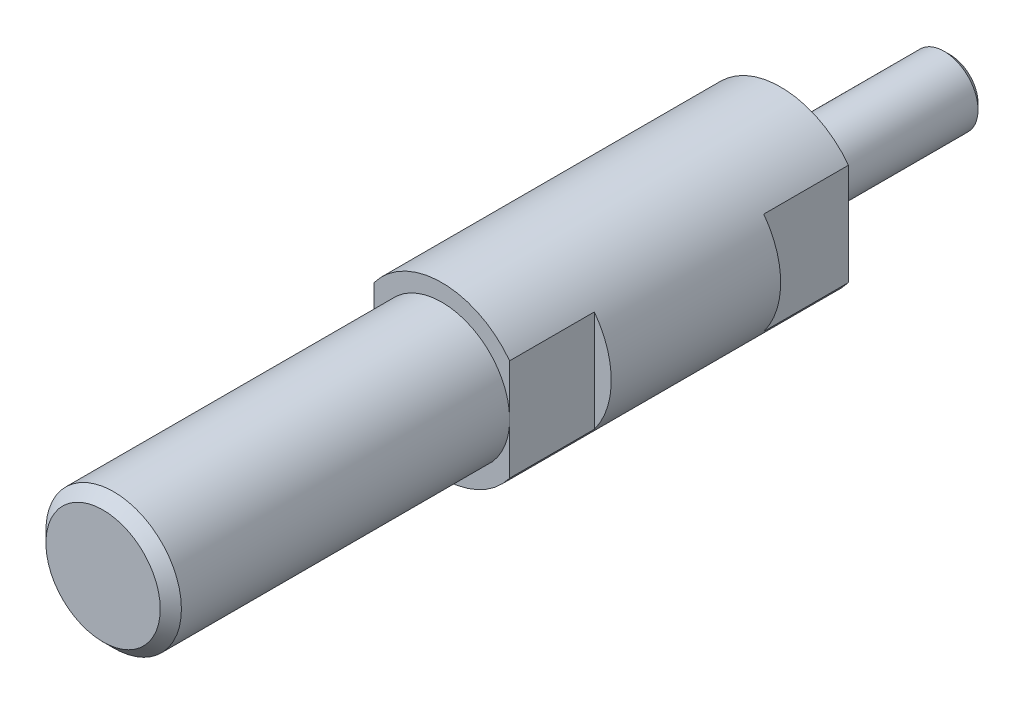
ISO-10303-21;
HEADER;
FILE_DESCRIPTION(('STEP AP214'),'2;1');
FILE_NAME('part.step','',(''),(''),'','','');
FILE_SCHEMA(('AUTOMOTIVE_DESIGN { 1 0 10303 214 1 1 1 1 }'));
ENDSEC;
DATA;
#1=APPLICATION_CONTEXT('core data for automotive mechanical design processes');
#2=APPLICATION_PROTOCOL_DEFINITION('international standard','automotive_design',2000,#1);
#3=PRODUCT_CONTEXT('',#1,'mechanical');
#4=PRODUCT('Part','Part','',(#3));
#5=PRODUCT_RELATED_PRODUCT_CATEGORY('part','',(#4));
#6=PRODUCT_DEFINITION_FORMATION('','',#4);
#7=PRODUCT_DEFINITION_CONTEXT('part definition',#1,'design');
#8=PRODUCT_DEFINITION('design','',#6,#7);
#9=PRODUCT_DEFINITION_SHAPE('','',#8);
#10=(LENGTH_UNIT() NAMED_UNIT(*) SI_UNIT(.MILLI.,.METRE.));
#11=(NAMED_UNIT(*) PLANE_ANGLE_UNIT() SI_UNIT($,.RADIAN.));
#12=(NAMED_UNIT(*) SI_UNIT($,.STERADIAN.) SOLID_ANGLE_UNIT());
#13=UNCERTAINTY_MEASURE_WITH_UNIT(LENGTH_MEASURE(1.E-05),#10,'distance_accuracy_value','');
#14=(GEOMETRIC_REPRESENTATION_CONTEXT(3) GLOBAL_UNCERTAINTY_ASSIGNED_CONTEXT((#13)) GLOBAL_UNIT_ASSIGNED_CONTEXT((#10,
#11,#12)) REPRESENTATION_CONTEXT('',''));
#15=CARTESIAN_POINT('',(0.,0.,0.));
#16=DIRECTION('',(0.,0.,1.));
#17=DIRECTION('',(1.,0.,0.));
#18=AXIS2_PLACEMENT_3D('',#15,#16,#17);
#19=CARTESIAN_POINT('',(0.,0.,-20.));
#20=DIRECTION('',(0.,0.,1.));
#21=DIRECTION('',(1.,0.,0.));
#22=AXIS2_PLACEMENT_3D('',#19,#20,#21);
#23=PLANE('',#22);
#24=CARTESIAN_POINT('',(0.,0.,-20.));
#25=DIRECTION('',(0.,0.,-1.));
#26=DIRECTION('',(-1.,0.,0.));
#27=AXIS2_PLACEMENT_3D('',#24,#25,#26);
#28=CIRCLE('',#27,2.);
#29=CARTESIAN_POINT('',(-2.,0.,-20.));
#30=VERTEX_POINT('',#29);
#31=EDGE_CURVE('E156',#30,#30,#28,.T.);
#32=ORIENTED_EDGE('',*,*,#31,.F.);
#33=EDGE_LOOP('',(#32));
#34=FACE_BOUND('',#33,.T.);
#35=DIRECTION('',(0.,1.,0.));
#36=VECTOR('',#35,1.);
#37=CARTESIAN_POINT('',(4.,-5.,-20.));
#38=LINE('',#37,#36);
#39=CARTESIAN_POINT('',(4.,-3.,-20.));
#40=VERTEX_POINT('',#39);
#41=CARTESIAN_POINT('',(4.,3.,-20.));
#42=VERTEX_POINT('',#41);
#43=EDGE_CURVE('E171',#40,#42,#38,.T.);
#44=ORIENTED_EDGE('',*,*,#43,.F.);
#45=CARTESIAN_POINT('',(0.,0.,-20.));
#46=DIRECTION('',(0.,0.,1.));
#47=DIRECTION('',(1.,0.,0.));
#48=AXIS2_PLACEMENT_3D('',#45,#46,#47);
#49=CIRCLE('',#48,5.);
#50=CARTESIAN_POINT('',(-4.,-3.,-20.));
#51=VERTEX_POINT('',#50);
#52=EDGE_CURVE('E150',#51,#40,#49,.T.);
#53=ORIENTED_EDGE('',*,*,#52,.F.);
#54=DIRECTION('',(0.,1.,0.));
#55=VECTOR('',#54,1.);
#56=CARTESIAN_POINT('',(-4.,-5.,-20.));
#57=LINE('',#56,#55);
#58=CARTESIAN_POINT('',(-4.,3.,-20.));
#59=VERTEX_POINT('',#58);
#60=EDGE_CURVE('E166',#51,#59,#57,.T.);
#61=ORIENTED_EDGE('',*,*,#60,.T.);
#62=EDGE_CURVE('E189',#42,#59,#49,.T.);
#63=ORIENTED_EDGE('',*,*,#62,.F.);
#64=EDGE_LOOP('',(#44,#53,#61,#63));
#65=FACE_BOUND('',#64,.T.);
#66=ADVANCED_FACE('F44',(#34,#65),#23,.F.);
#67=CARTESIAN_POINT('',(0.,0.,0.));
#68=DIRECTION('',(0.,0.,1.));
#69=DIRECTION('',(1.,0.,0.));
#70=AXIS2_PLACEMENT_3D('',#67,#68,#69);
#71=PLANE('',#70);
#72=DIRECTION('',(0.,1.,0.));
#73=VECTOR('',#72,1.);
#74=CARTESIAN_POINT('',(-4.,-5.,0.));
#75=LINE('',#74,#73);
#76=CARTESIAN_POINT('',(-4.,-3.,0.));
#77=VERTEX_POINT('',#76);
#78=CARTESIAN_POINT('',(-4.,0.,0.));
#79=VERTEX_POINT('',#78);
#80=EDGE_CURVE('E144',#77,#79,#75,.T.);
#81=ORIENTED_EDGE('',*,*,#80,.F.);
#82=CARTESIAN_POINT('',(0.,0.,0.));
#83=DIRECTION('',(0.,0.,1.));
#84=DIRECTION('',(1.,0.,0.));
#85=AXIS2_PLACEMENT_3D('',#82,#83,#84);
#86=CIRCLE('',#85,5.);
#87=CARTESIAN_POINT('',(4.,-3.,0.));
#88=VERTEX_POINT('',#87);
#89=EDGE_CURVE('E137',#77,#88,#86,.T.);
#90=ORIENTED_EDGE('',*,*,#89,.T.);
#91=DIRECTION('',(0.,1.,0.));
#92=VECTOR('',#91,1.);
#93=CARTESIAN_POINT('',(4.,-5.,0.));
#94=LINE('',#93,#92);
#95=CARTESIAN_POINT('',(4.,0.,0.));
#96=VERTEX_POINT('',#95);
#97=EDGE_CURVE('E116',#88,#96,#94,.T.);
#98=ORIENTED_EDGE('',*,*,#97,.T.);
#99=CARTESIAN_POINT('',(0.,0.,0.));
#100=DIRECTION('',(0.,0.,1.));
#101=DIRECTION('',(1.,0.,0.));
#102=AXIS2_PLACEMENT_3D('',#99,#100,#101);
#103=CIRCLE('',#102,4.);
#104=EDGE_CURVE('E188',#79,#96,#103,.T.);
#105=ORIENTED_EDGE('',*,*,#104,.F.);
#106=EDGE_LOOP('',(#81,#90,#98,#105));
#107=FACE_BOUND('',#106,.T.);
#108=ADVANCED_FACE('F141',(#107),#71,.T.);
#109=CARTESIAN_POINT('',(-4.,3.,0.));
#110=VERTEX_POINT('',#109);
#111=EDGE_CURVE('E177',#79,#110,#75,.T.);
#112=ORIENTED_EDGE('',*,*,#111,.F.);
#113=EDGE_CURVE('E192',#96,#79,#103,.T.);
#114=ORIENTED_EDGE('',*,*,#113,.F.);
#115=CARTESIAN_POINT('',(4.,3.,0.));
#116=VERTEX_POINT('',#115);
#117=EDGE_CURVE('E124',#96,#116,#94,.T.);
#118=ORIENTED_EDGE('',*,*,#117,.T.);
#119=EDGE_CURVE('E143',#116,#110,#86,.T.);
#120=ORIENTED_EDGE('',*,*,#119,.T.);
#121=EDGE_LOOP('',(#112,#114,#118,#120));
#122=FACE_BOUND('',#121,.T.);
#123=ADVANCED_FACE('F216',(#122),#71,.T.);
#124=CARTESIAN_POINT('',(0.,0.,-20.));
#125=DIRECTION('',(0.,0.,1.));
#126=DIRECTION('',(1.,0.,0.));
#127=AXIS2_PLACEMENT_3D('',#124,#125,#126);
#128=CYLINDRICAL_SURFACE('',#127,5.);
#129=DIRECTION('',(0.,0.,1.));
#130=VECTOR('',#129,1.);
#131=CARTESIAN_POINT('',(-4.,3.,-20.));
#132=LINE('',#131,#130);
#133=CARTESIAN_POINT('',(-4.,3.,-5.));
#134=VERTEX_POINT('',#133);
#135=EDGE_CURVE('E201',#110,#134,#132,.F.);
#136=ORIENTED_EDGE('',*,*,#135,.F.);
#137=ORIENTED_EDGE('',*,*,#119,.F.);
#138=DIRECTION('',(0.,0.,1.));
#139=VECTOR('',#138,1.);
#140=CARTESIAN_POINT('',(4.,3.,-20.));
#141=LINE('',#140,#139);
#142=CARTESIAN_POINT('',(4.,3.,-5.));
#143=VERTEX_POINT('',#142);
#144=EDGE_CURVE('E138',#143,#116,#141,.T.);
#145=ORIENTED_EDGE('',*,*,#144,.F.);
#146=CARTESIAN_POINT('',(0.,0.,-5.));
#147=DIRECTION('',(0.,0.,-1.));
#148=DIRECTION('',(-1.,0.,0.));
#149=AXIS2_PLACEMENT_3D('',#146,#147,#148);
#150=CIRCLE('',#149,5.);
#151=CARTESIAN_POINT('',(4.,-3.,-5.));
#152=VERTEX_POINT('',#151);
#153=EDGE_CURVE('E140',#152,#143,#150,.F.);
#154=ORIENTED_EDGE('',*,*,#153,.F.);
#155=DIRECTION('',(0.,0.,1.));
#156=VECTOR('',#155,1.);
#157=CARTESIAN_POINT('',(4.,-3.,-20.));
#158=LINE('',#157,#156);
#159=EDGE_CURVE('E119',#88,#152,#158,.F.);
#160=ORIENTED_EDGE('',*,*,#159,.F.);
#161=ORIENTED_EDGE('',*,*,#89,.F.);
#162=DIRECTION('',(0.,0.,1.));
#163=VECTOR('',#162,1.);
#164=CARTESIAN_POINT('',(-4.,-3.,-20.));
#165=LINE('',#164,#163);
#166=CARTESIAN_POINT('',(-4.,-3.,-5.));
#167=VERTEX_POINT('',#166);
#168=EDGE_CURVE('E136',#167,#77,#165,.T.);
#169=ORIENTED_EDGE('',*,*,#168,.F.);
#170=CARTESIAN_POINT('',(0.,0.,-5.));
#171=DIRECTION('',(0.,0.,-1.));
#172=DIRECTION('',(-1.,0.,0.));
#173=AXIS2_PLACEMENT_3D('',#170,#171,#172);
#174=CIRCLE('',#173,5.);
#175=EDGE_CURVE('E11',#134,#167,#174,.F.);
#176=ORIENTED_EDGE('',*,*,#175,.F.);
#177=EDGE_LOOP('',(#136,#137,#145,#154,#160,#161,#169,#176));
#178=FACE_BOUND('',#177,.T.);
#179=DIRECTION('',(0.,0.,1.));
#180=VECTOR('',#179,1.);
#181=CARTESIAN_POINT('',(4.,-3.,-20.));
#182=LINE('',#181,#180);
#183=CARTESIAN_POINT('',(4.,-3.,-15.));
#184=VERTEX_POINT('',#183);
#185=EDGE_CURVE('E148',#184,#40,#182,.F.);
#186=ORIENTED_EDGE('',*,*,#185,.F.);
#187=CARTESIAN_POINT('',(0.,0.,-15.));
#188=DIRECTION('',(0.,0.,1.));
#189=DIRECTION('',(1.,0.,0.));
#190=AXIS2_PLACEMENT_3D('',#187,#188,#189);
#191=CIRCLE('',#190,5.);
#192=CARTESIAN_POINT('',(4.,3.,-15.));
#193=VERTEX_POINT('',#192);
#194=EDGE_CURVE('E53',#193,#184,#191,.F.);
#195=ORIENTED_EDGE('',*,*,#194,.F.);
#196=DIRECTION('',(0.,0.,1.));
#197=VECTOR('',#196,1.);
#198=CARTESIAN_POINT('',(4.,3.,-20.));
#199=LINE('',#198,#197);
#200=EDGE_CURVE('E146',#42,#193,#199,.T.);
#201=ORIENTED_EDGE('',*,*,#200,.F.);
#202=ORIENTED_EDGE('',*,*,#62,.T.);
#203=DIRECTION('',(0.,0.,1.));
#204=VECTOR('',#203,1.);
#205=CARTESIAN_POINT('',(-4.,3.,-20.));
#206=LINE('',#205,#204);
#207=CARTESIAN_POINT('',(-4.,3.,-15.));
#208=VERTEX_POINT('',#207);
#209=EDGE_CURVE('E202',#208,#59,#206,.F.);
#210=ORIENTED_EDGE('',*,*,#209,.F.);
#211=CARTESIAN_POINT('',(0.,0.,-15.));
#212=DIRECTION('',(0.,0.,1.));
#213=DIRECTION('',(1.,0.,0.));
#214=AXIS2_PLACEMENT_3D('',#211,#212,#213);
#215=CIRCLE('',#214,5.);
#216=CARTESIAN_POINT('',(-4.,-3.,-15.));
#217=VERTEX_POINT('',#216);
#218=EDGE_CURVE('E169',#217,#208,#215,.F.);
#219=ORIENTED_EDGE('',*,*,#218,.F.);
#220=DIRECTION('',(0.,0.,1.));
#221=VECTOR('',#220,1.);
#222=CARTESIAN_POINT('',(-4.,-3.,-20.));
#223=LINE('',#222,#221);
#224=EDGE_CURVE('E184',#51,#217,#223,.T.);
#225=ORIENTED_EDGE('',*,*,#224,.F.);
#226=ORIENTED_EDGE('',*,*,#52,.T.);
#227=EDGE_LOOP('',(#186,#195,#201,#202,#210,#219,#225,#226));
#228=FACE_BOUND('',#227,.T.);
#229=ADVANCED_FACE('F132',(#178,#228),#128,.T.);
#230=CARTESIAN_POINT('',(0.,0.,20.));
#231=DIRECTION('',(0.,0.,-1.));
#232=DIRECTION('',(-1.,0.,0.));
#233=AXIS2_PLACEMENT_3D('',#230,#231,#232);
#234=CYLINDRICAL_SURFACE('',#233,4.);
#235=CARTESIAN_POINT('',(0.,0.,19.375));
#236=DIRECTION('',(0.,0.,1.));
#237=DIRECTION('',(1.,0.,0.));
#238=AXIS2_PLACEMENT_3D('',#235,#236,#237);
#239=CIRCLE('',#238,4.);
#240=CARTESIAN_POINT('',(4.,0.,19.375));
#241=VERTEX_POINT('',#240);
#242=EDGE_CURVE('E160',#241,#241,#239,.F.);
#243=ORIENTED_EDGE('',*,*,#242,.T.);
#244=EDGE_LOOP('',(#243));
#245=FACE_BOUND('',#244,.T.);
#246=ORIENTED_EDGE('',*,*,#113,.T.);
#247=ORIENTED_EDGE('',*,*,#104,.T.);
#248=EDGE_LOOP('',(#246,#247));
#249=FACE_BOUND('',#248,.T.);
#250=ADVANCED_FACE('F222',(#245,#249),#234,.T.);
#251=CARTESIAN_POINT('',(0.,0.,20.));
#252=DIRECTION('',(0.,0.,1.));
#253=DIRECTION('',(1.,0.,0.));
#254=AXIS2_PLACEMENT_3D('',#251,#252,#253);
#255=PLANE('',#254);
#256=CARTESIAN_POINT('',(0.,0.,20.));
#257=DIRECTION('',(0.,0.,1.));
#258=DIRECTION('',(1.,0.,0.));
#259=AXIS2_PLACEMENT_3D('',#256,#257,#258);
#260=CIRCLE('',#259,3.375);
#261=CARTESIAN_POINT('',(3.375,0.,20.));
#262=VERTEX_POINT('',#261);
#263=EDGE_CURVE('E151',#262,#262,#260,.T.);
#264=ORIENTED_EDGE('',*,*,#263,.T.);
#265=EDGE_LOOP('',(#264));
#266=FACE_BOUND('',#265,.T.);
#267=ADVANCED_FACE('F225',(#266),#255,.T.);
#268=CARTESIAN_POINT('',(0.,0.,-30.));
#269=DIRECTION('',(0.,0.,1.));
#270=DIRECTION('',(1.,0.,0.));
#271=AXIS2_PLACEMENT_3D('',#268,#269,#270);
#272=CYLINDRICAL_SURFACE('',#271,2.);
#273=CARTESIAN_POINT('',(0.,0.,-29.65));
#274=DIRECTION('',(0.,0.,-1.));
#275=DIRECTION('',(-1.,0.,0.));
#276=AXIS2_PLACEMENT_3D('',#273,#274,#275);
#277=CIRCLE('',#276,2.);
#278=CARTESIAN_POINT('',(-2.,0.,-29.65));
#279=VERTEX_POINT('',#278);
#280=EDGE_CURVE('E164',#279,#279,#277,.F.);
#281=ORIENTED_EDGE('',*,*,#280,.T.);
#282=EDGE_LOOP('',(#281));
#283=FACE_BOUND('',#282,.T.);
#284=ORIENTED_EDGE('',*,*,#31,.T.);
#285=EDGE_LOOP('',(#284));
#286=FACE_BOUND('',#285,.T.);
#287=ADVANCED_FACE('F233',(#283,#286),#272,.T.);
#288=CARTESIAN_POINT('',(0.,0.,-30.));
#289=DIRECTION('',(0.,0.,-1.));
#290=DIRECTION('',(-1.,0.,0.));
#291=AXIS2_PLACEMENT_3D('',#288,#289,#290);
#292=PLANE('',#291);
#293=CARTESIAN_POINT('',(0.,0.,-30.));
#294=DIRECTION('',(0.,0.,-1.));
#295=DIRECTION('',(-1.,0.,0.));
#296=AXIS2_PLACEMENT_3D('',#293,#294,#295);
#297=CIRCLE('',#296,1.65000000000001);
#298=CARTESIAN_POINT('',(-1.65000000000001,0.,-30.));
#299=VERTEX_POINT('',#298);
#300=EDGE_CURVE('E162',#299,#299,#297,.T.);
#301=ORIENTED_EDGE('',*,*,#300,.T.);
#302=EDGE_LOOP('',(#301));
#303=FACE_BOUND('',#302,.T.);
#304=ADVANCED_FACE('F248',(#303),#292,.T.);
#305=CARTESIAN_POINT('',(0.,0.,20.));
#306=DIRECTION('',(0.,0.,-1.));
#307=DIRECTION('',(-1.,0.,0.));
#308=AXIS2_PLACEMENT_3D('',#305,#306,#307);
#309=CONICAL_SURFACE('',#308,3.375,0.785398163397448);
#310=ORIENTED_EDGE('',*,*,#242,.F.);
#311=EDGE_LOOP('',(#310));
#312=FACE_BOUND('',#311,.T.);
#313=ORIENTED_EDGE('',*,*,#263,.F.);
#314=EDGE_LOOP('',(#313));
#315=FACE_BOUND('',#314,.T.);
#316=ADVANCED_FACE('F244',(#312,#315),#309,.T.);
#317=CARTESIAN_POINT('',(0.,0.,-30.));
#318=DIRECTION('',(0.,0.,1.));
#319=DIRECTION('',(1.,0.,0.));
#320=AXIS2_PLACEMENT_3D('',#317,#318,#319);
#321=CONICAL_SURFACE('',#320,1.65000000000001,0.785398163397451);
#322=ORIENTED_EDGE('',*,*,#280,.F.);
#323=EDGE_LOOP('',(#322));
#324=FACE_BOUND('',#323,.T.);
#325=ORIENTED_EDGE('',*,*,#300,.F.);
#326=EDGE_LOOP('',(#325));
#327=FACE_BOUND('',#326,.T.);
#328=ADVANCED_FACE('F48',(#324,#327),#321,.T.);
#329=CARTESIAN_POINT('',(-4.,-5.,-15.));
#330=DIRECTION('',(1.,0.,0.));
#331=DIRECTION('',(0.,0.,-1.));
#332=AXIS2_PLACEMENT_3D('',#329,#330,#331);
#333=PLANE('',#332);
#334=ORIENTED_EDGE('',*,*,#209,.T.);
#335=ORIENTED_EDGE('',*,*,#60,.F.);
#336=ORIENTED_EDGE('',*,*,#224,.T.);
#337=DIRECTION('',(0.,1.,0.));
#338=VECTOR('',#337,1.);
#339=CARTESIAN_POINT('',(-4.,-5.,-15.));
#340=LINE('',#339,#338);
#341=EDGE_CURVE('E206',#217,#208,#340,.T.);
#342=ORIENTED_EDGE('',*,*,#341,.T.);
#343=EDGE_LOOP('',(#334,#335,#336,#342));
#344=FACE_BOUND('',#343,.T.);
#345=ADVANCED_FACE('F253',(#344),#333,.F.);
#346=CARTESIAN_POINT('',(-5.,-5.,-15.));
#347=DIRECTION('',(0.,0.,1.));
#348=DIRECTION('',(1.,0.,0.));
#349=AXIS2_PLACEMENT_3D('',#346,#347,#348);
#350=PLANE('',#349);
#351=ORIENTED_EDGE('',*,*,#341,.F.);
#352=ORIENTED_EDGE('',*,*,#218,.T.);
#353=EDGE_LOOP('',(#351,#352));
#354=FACE_BOUND('',#353,.T.);
#355=ADVANCED_FACE('F268',(#354),#350,.F.);
#356=CARTESIAN_POINT('',(4.,-5.,-5.));
#357=DIRECTION('',(-1.,0.,0.));
#358=DIRECTION('',(0.,0.,1.));
#359=AXIS2_PLACEMENT_3D('',#356,#357,#358);
#360=PLANE('',#359);
#361=ORIENTED_EDGE('',*,*,#159,.T.);
#362=DIRECTION('',(0.,1.,0.));
#363=VECTOR('',#362,1.);
#364=CARTESIAN_POINT('',(4.,-5.,-5.));
#365=LINE('',#364,#363);
#366=EDGE_CURVE('E127',#152,#143,#365,.T.);
#367=ORIENTED_EDGE('',*,*,#366,.T.);
#368=ORIENTED_EDGE('',*,*,#144,.T.);
#369=ORIENTED_EDGE('',*,*,#117,.F.);
#370=ORIENTED_EDGE('',*,*,#97,.F.);
#371=EDGE_LOOP('',(#361,#367,#368,#369,#370));
#372=FACE_BOUND('',#371,.T.);
#373=ADVANCED_FACE('F117',(#372),#360,.F.);
#374=CARTESIAN_POINT('',(5.,-5.,-5.));
#375=DIRECTION('',(0.,0.,-1.));
#376=DIRECTION('',(-1.,0.,0.));
#377=AXIS2_PLACEMENT_3D('',#374,#375,#376);
#378=PLANE('',#377);
#379=ORIENTED_EDGE('',*,*,#366,.F.);
#380=ORIENTED_EDGE('',*,*,#153,.T.);
#381=EDGE_LOOP('',(#379,#380));
#382=FACE_BOUND('',#381,.T.);
#383=ADVANCED_FACE('F283',(#382),#378,.F.);
#384=CARTESIAN_POINT('',(4.,-5.,-15.));
#385=DIRECTION('',(-1.,0.,0.));
#386=DIRECTION('',(0.,0.,1.));
#387=AXIS2_PLACEMENT_3D('',#384,#385,#386);
#388=PLANE('',#387);
#389=ORIENTED_EDGE('',*,*,#185,.T.);
#390=ORIENTED_EDGE('',*,*,#43,.T.);
#391=ORIENTED_EDGE('',*,*,#200,.T.);
#392=DIRECTION('',(0.,1.,0.));
#393=VECTOR('',#392,1.);
#394=CARTESIAN_POINT('',(4.,-5.,-15.));
#395=LINE('',#394,#393);
#396=EDGE_CURVE('E68',#184,#193,#395,.T.);
#397=ORIENTED_EDGE('',*,*,#396,.F.);
#398=EDGE_LOOP('',(#389,#390,#391,#397));
#399=FACE_BOUND('',#398,.T.);
#400=ADVANCED_FACE('F180',(#399),#388,.F.);
#401=CARTESIAN_POINT('',(5.,-5.,-15.));
#402=DIRECTION('',(0.,0.,1.));
#403=DIRECTION('',(1.,0.,0.));
#404=AXIS2_PLACEMENT_3D('',#401,#402,#403);
#405=PLANE('',#404);
#406=ORIENTED_EDGE('',*,*,#194,.T.);
#407=ORIENTED_EDGE('',*,*,#396,.T.);
#408=EDGE_LOOP('',(#406,#407));
#409=FACE_BOUND('',#408,.T.);
#410=ADVANCED_FACE('F173',(#409),#405,.F.);
#411=CARTESIAN_POINT('',(-4.,-5.,-5.));
#412=DIRECTION('',(1.,0.,0.));
#413=DIRECTION('',(0.,0.,-1.));
#414=AXIS2_PLACEMENT_3D('',#411,#412,#413);
#415=PLANE('',#414);
#416=ORIENTED_EDGE('',*,*,#135,.T.);
#417=DIRECTION('',(0.,1.,0.));
#418=VECTOR('',#417,1.);
#419=CARTESIAN_POINT('',(-4.,-5.,-5.));
#420=LINE('',#419,#418);
#421=EDGE_CURVE('E56',#167,#134,#420,.T.);
#422=ORIENTED_EDGE('',*,*,#421,.F.);
#423=ORIENTED_EDGE('',*,*,#168,.T.);
#424=ORIENTED_EDGE('',*,*,#80,.T.);
#425=ORIENTED_EDGE('',*,*,#111,.T.);
#426=EDGE_LOOP('',(#416,#422,#423,#424,#425));
#427=FACE_BOUND('',#426,.T.);
#428=ADVANCED_FACE('F277',(#427),#415,.F.);
#429=CARTESIAN_POINT('',(-5.,-5.,-5.));
#430=DIRECTION('',(0.,0.,-1.));
#431=DIRECTION('',(-1.,0.,0.));
#432=AXIS2_PLACEMENT_3D('',#429,#430,#431);
#433=PLANE('',#432);
#434=ORIENTED_EDGE('',*,*,#175,.T.);
#435=ORIENTED_EDGE('',*,*,#421,.T.);
#436=EDGE_LOOP('',(#434,#435));
#437=FACE_BOUND('',#436,.T.);
#438=ADVANCED_FACE('F284',(#437),#433,.F.);
#439=CLOSED_SHELL('',(#66,#108,#123,#229,#250,#267,#287,#304,#316,#328,#345,#355,#373,#383,#400,
#410,#428,#438));
#440=MANIFOLD_SOLID_BREP('B2',#439);
#441=ADVANCED_BREP_SHAPE_REPRESENTATION('',(#18,#440),#14);
#442=SHAPE_DEFINITION_REPRESENTATION(#9,#441);
ENDSEC;
END-ISO-10303-21;
